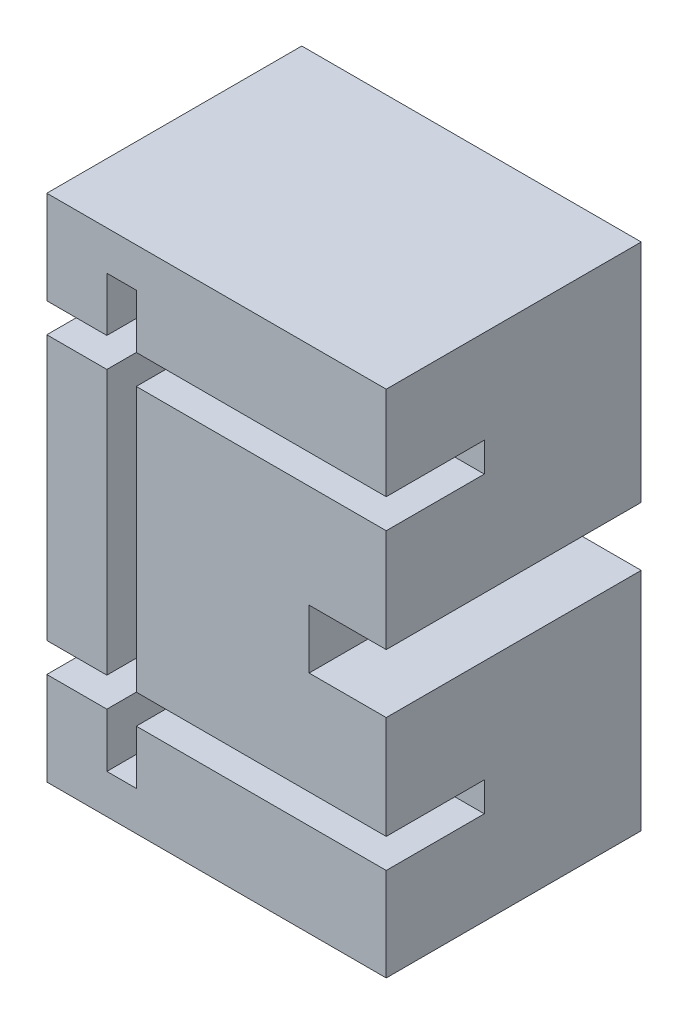
ISO-10303-21;
HEADER;
FILE_DESCRIPTION(('STEP AP214'),'2;1');
FILE_NAME('part.step','',(''),(''),'','','');
FILE_SCHEMA(('AUTOMOTIVE_DESIGN { 1 0 10303 214 1 1 1 1 }'));
ENDSEC;
DATA;
#1=APPLICATION_CONTEXT('core data for automotive mechanical design processes');
#2=APPLICATION_PROTOCOL_DEFINITION('international standard','automotive_design',2000,#1);
#3=PRODUCT_CONTEXT('',#1,'mechanical');
#4=PRODUCT('Part','Part','',(#3));
#5=PRODUCT_RELATED_PRODUCT_CATEGORY('part','',(#4));
#6=PRODUCT_DEFINITION_FORMATION('','',#4);
#7=PRODUCT_DEFINITION_CONTEXT('part definition',#1,'design');
#8=PRODUCT_DEFINITION('design','',#6,#7);
#9=PRODUCT_DEFINITION_SHAPE('','',#8);
#10=(LENGTH_UNIT() NAMED_UNIT(*) SI_UNIT(.MILLI.,.METRE.));
#11=(NAMED_UNIT(*) PLANE_ANGLE_UNIT() SI_UNIT($,.RADIAN.));
#12=(NAMED_UNIT(*) SI_UNIT($,.STERADIAN.) SOLID_ANGLE_UNIT());
#13=UNCERTAINTY_MEASURE_WITH_UNIT(LENGTH_MEASURE(1.E-05),#10,'distance_accuracy_value','');
#14=(GEOMETRIC_REPRESENTATION_CONTEXT(3) GLOBAL_UNCERTAINTY_ASSIGNED_CONTEXT((#13)) GLOBAL_UNIT_ASSIGNED_CONTEXT((#10,
#11,#12)) REPRESENTATION_CONTEXT('',''));
#15=CARTESIAN_POINT('',(0.,0.,0.));
#16=DIRECTION('',(0.,0.,1.));
#17=DIRECTION('',(1.,0.,0.));
#18=AXIS2_PLACEMENT_3D('',#15,#16,#17);
#19=CARTESIAN_POINT('',(10.2437538843778,0.,13.));
#20=DIRECTION('',(-1.,0.,0.));
#21=DIRECTION('',(0.,0.,1.));
#22=AXIS2_PLACEMENT_3D('',#19,#20,#21);
#23=PLANE('',#22);
#24=DIRECTION('',(0.,0.,1.));
#25=VECTOR('',#24,1.);
#26=CARTESIAN_POINT('',(10.2437538843778,8.25,8.));
#27=LINE('',#26,#25);
#28=CARTESIAN_POINT('',(10.2437538843778,8.25,8.));
#29=VERTEX_POINT('',#28);
#30=CARTESIAN_POINT('',(10.2437538843778,8.25,13.));
#31=VERTEX_POINT('',#30);
#32=EDGE_CURVE('E150',#29,#31,#27,.T.);
#33=ORIENTED_EDGE('',*,*,#32,.F.);
#34=DIRECTION('',(0.,1.,0.));
#35=VECTOR('',#34,1.);
#36=CARTESIAN_POINT('',(10.2437538843778,0.,8.));
#37=LINE('',#36,#35);
#38=CARTESIAN_POINT('',(10.2437538843778,6.75,8.));
#39=VERTEX_POINT('',#38);
#40=EDGE_CURVE('E284',#39,#29,#37,.T.);
#41=ORIENTED_EDGE('',*,*,#40,.F.);
#42=DIRECTION('',(0.,0.,1.));
#43=VECTOR('',#42,1.);
#44=CARTESIAN_POINT('',(10.2437538843778,6.75,8.));
#45=LINE('',#44,#43);
#46=CARTESIAN_POINT('',(10.2437538843778,6.75,13.));
#47=VERTEX_POINT('',#46);
#48=EDGE_CURVE('E295',#39,#47,#45,.T.);
#49=ORIENTED_EDGE('',*,*,#48,.T.);
#50=DIRECTION('',(0.,1.,0.));
#51=VECTOR('',#50,1.);
#52=CARTESIAN_POINT('',(10.2437538843778,0.,13.));
#53=LINE('',#52,#51);
#54=CARTESIAN_POINT('',(10.2437538843778,1.5,13.));
#55=VERTEX_POINT('',#54);
#56=EDGE_CURVE('E211',#55,#47,#53,.T.);
#57=ORIENTED_EDGE('',*,*,#56,.F.);
#58=DIRECTION('',(0.,0.,-1.));
#59=VECTOR('',#58,1.);
#60=CARTESIAN_POINT('',(10.2437538843778,1.5,13.));
#61=LINE('',#60,#59);
#62=CARTESIAN_POINT('',(10.2437538843778,1.5,0.));
#63=VERTEX_POINT('',#62);
#64=EDGE_CURVE('E57',#55,#63,#61,.T.);
#65=ORIENTED_EDGE('',*,*,#64,.T.);
#66=DIRECTION('',(0.,1.,0.));
#67=VECTOR('',#66,1.);
#68=CARTESIAN_POINT('',(10.2437538843778,0.,0.));
#69=LINE('',#68,#67);
#70=CARTESIAN_POINT('',(10.2437538843778,13.,0.));
#71=VERTEX_POINT('',#70);
#72=EDGE_CURVE('E147',#63,#71,#69,.T.);
#73=ORIENTED_EDGE('',*,*,#72,.T.);
#74=DIRECTION('',(0.,0.,-1.));
#75=VECTOR('',#74,1.);
#76=CARTESIAN_POINT('',(10.2437538843778,13.,13.));
#77=LINE('',#76,#75);
#78=CARTESIAN_POINT('',(10.2437538843778,13.,13.));
#79=VERTEX_POINT('',#78);
#80=EDGE_CURVE('E11',#79,#71,#77,.T.);
#81=ORIENTED_EDGE('',*,*,#80,.F.);
#82=EDGE_CURVE('E96',#31,#79,#53,.T.);
#83=ORIENTED_EDGE('',*,*,#82,.F.);
#84=EDGE_LOOP('',(#33,#41,#49,#57,#65,#73,#81,#83));
#85=FACE_BOUND('',#84,.T.);
#86=ADVANCED_FACE('F34',(#85),#23,.F.);
#87=CARTESIAN_POINT('',(10.2437538843778,0.,13.));
#88=DIRECTION('',(-1.,0.,0.));
#89=DIRECTION('',(0.,0.,1.));
#90=AXIS2_PLACEMENT_3D('',#87,#88,#89);
#91=PLANE('',#90);
#92=DIRECTION('',(0.,0.,1.));
#93=VECTOR('',#92,1.);
#94=CARTESIAN_POINT('',(10.2437538843778,-6.75,8.));
#95=LINE('',#94,#93);
#96=CARTESIAN_POINT('',(10.2437538843778,-6.75,8.));
#97=VERTEX_POINT('',#96);
#98=CARTESIAN_POINT('',(10.2437538843778,-6.75,13.));
#99=VERTEX_POINT('',#98);
#100=EDGE_CURVE('E239',#97,#99,#95,.T.);
#101=ORIENTED_EDGE('',*,*,#100,.F.);
#102=DIRECTION('',(0.,1.,0.));
#103=VECTOR('',#102,1.);
#104=CARTESIAN_POINT('',(10.2437538843778,0.,8.));
#105=LINE('',#104,#103);
#106=CARTESIAN_POINT('',(10.2437538843778,-8.25,8.));
#107=VERTEX_POINT('',#106);
#108=EDGE_CURVE('E235',#107,#97,#105,.T.);
#109=ORIENTED_EDGE('',*,*,#108,.F.);
#110=DIRECTION('',(0.,0.,1.));
#111=VECTOR('',#110,1.);
#112=CARTESIAN_POINT('',(10.2437538843778,-8.25,8.));
#113=LINE('',#112,#111);
#114=CARTESIAN_POINT('',(10.2437538843778,-8.25,13.));
#115=VERTEX_POINT('',#114);
#116=EDGE_CURVE('E232',#107,#115,#113,.T.);
#117=ORIENTED_EDGE('',*,*,#116,.T.);
#118=DIRECTION('',(0.,1.,0.));
#119=VECTOR('',#118,1.);
#120=CARTESIAN_POINT('',(10.2437538843778,0.,13.));
#121=LINE('',#120,#119);
#122=CARTESIAN_POINT('',(10.2437538843778,-13.,13.));
#123=VERTEX_POINT('',#122);
#124=EDGE_CURVE('E128',#123,#115,#121,.T.);
#125=ORIENTED_EDGE('',*,*,#124,.F.);
#126=DIRECTION('',(0.,0.,-1.));
#127=VECTOR('',#126,1.);
#128=CARTESIAN_POINT('',(10.2437538843778,-13.,13.));
#129=LINE('',#128,#127);
#130=CARTESIAN_POINT('',(10.2437538843778,-13.,0.));
#131=VERTEX_POINT('',#130);
#132=EDGE_CURVE('E169',#123,#131,#129,.T.);
#133=ORIENTED_EDGE('',*,*,#132,.T.);
#134=DIRECTION('',(0.,1.,0.));
#135=VECTOR('',#134,1.);
#136=CARTESIAN_POINT('',(10.2437538843778,0.,0.));
#137=LINE('',#136,#135);
#138=CARTESIAN_POINT('',(10.2437538843778,-1.5,0.));
#139=VERTEX_POINT('',#138);
#140=EDGE_CURVE('E158',#131,#139,#137,.T.);
#141=ORIENTED_EDGE('',*,*,#140,.T.);
#142=DIRECTION('',(0.,0.,-1.));
#143=VECTOR('',#142,1.);
#144=CARTESIAN_POINT('',(10.2437538843778,-1.5,13.));
#145=LINE('',#144,#143);
#146=CARTESIAN_POINT('',(10.2437538843778,-1.5,13.));
#147=VERTEX_POINT('',#146);
#148=EDGE_CURVE('E138',#147,#139,#145,.T.);
#149=ORIENTED_EDGE('',*,*,#148,.F.);
#150=EDGE_CURVE('E124',#99,#147,#121,.T.);
#151=ORIENTED_EDGE('',*,*,#150,.F.);
#152=EDGE_LOOP('',(#101,#109,#117,#125,#133,#141,#149,#151));
#153=FACE_BOUND('',#152,.T.);
#154=ADVANCED_FACE('F229',(#153),#91,.F.);
#155=CARTESIAN_POINT('',(0.,0.,13.));
#156=DIRECTION('',(0.,0.,1.));
#157=DIRECTION('',(1.,0.,0.));
#158=AXIS2_PLACEMENT_3D('',#155,#156,#157);
#159=PLANE('',#158);
#160=DIRECTION('',(1.,0.,0.));
#161=VECTOR('',#160,1.);
#162=CARTESIAN_POINT('',(0.,6.75,13.));
#163=LINE('',#162,#161);
#164=CARTESIAN_POINT('',(-2.5,6.75,13.));
#165=VERTEX_POINT('',#164);
#166=EDGE_CURVE('E290',#165,#47,#163,.T.);
#167=ORIENTED_EDGE('',*,*,#166,.F.);
#168=DIRECTION('',(0.,-1.,0.));
#169=VECTOR('',#168,1.);
#170=CARTESIAN_POINT('',(-2.5,0.,13.));
#171=LINE('',#170,#169);
#172=CARTESIAN_POINT('',(-2.5,-6.75,13.));
#173=VERTEX_POINT('',#172);
#174=EDGE_CURVE('E316',#165,#173,#171,.T.);
#175=ORIENTED_EDGE('',*,*,#174,.T.);
#176=DIRECTION('',(1.,0.,0.));
#177=VECTOR('',#176,1.);
#178=CARTESIAN_POINT('',(0.,-6.75,13.));
#179=LINE('',#178,#177);
#180=EDGE_CURVE('E324',#173,#99,#179,.T.);
#181=ORIENTED_EDGE('',*,*,#180,.T.);
#182=ORIENTED_EDGE('',*,*,#150,.T.);
#183=DIRECTION('',(-1.,0.,0.));
#184=VECTOR('',#183,1.);
#185=CARTESIAN_POINT('',(0.,-1.5,13.));
#186=LINE('',#185,#184);
#187=CARTESIAN_POINT('',(6.3125,-1.5,13.));
#188=VERTEX_POINT('',#187);
#189=EDGE_CURVE('E115',#147,#188,#186,.T.);
#190=ORIENTED_EDGE('',*,*,#189,.T.);
#191=DIRECTION('',(0.,-1.,0.));
#192=VECTOR('',#191,1.);
#193=CARTESIAN_POINT('',(6.3125,0.,13.));
#194=LINE('',#193,#192);
#195=CARTESIAN_POINT('',(6.3125,1.5,13.));
#196=VERTEX_POINT('',#195);
#197=EDGE_CURVE('E121',#196,#188,#194,.T.);
#198=ORIENTED_EDGE('',*,*,#197,.F.);
#199=DIRECTION('',(-1.,0.,0.));
#200=VECTOR('',#199,1.);
#201=CARTESIAN_POINT('',(0.,1.5,13.));
#202=LINE('',#201,#200);
#203=EDGE_CURVE('E142',#55,#196,#202,.T.);
#204=ORIENTED_EDGE('',*,*,#203,.F.);
#205=ORIENTED_EDGE('',*,*,#56,.T.);
#206=EDGE_LOOP('',(#167,#175,#181,#182,#190,#198,#204,#205));
#207=FACE_BOUND('',#206,.T.);
#208=ADVANCED_FACE('F118',(#207),#159,.T.);
#209=DIRECTION('',(0.,-1.,0.));
#210=VECTOR('',#209,1.);
#211=CARTESIAN_POINT('',(-7.06249999999999,0.,13.));
#212=LINE('',#211,#210);
#213=CARTESIAN_POINT('',(-7.06249999999999,6.75,13.));
#214=VERTEX_POINT('',#213);
#215=CARTESIAN_POINT('',(-7.06249999999999,-6.75,13.));
#216=VERTEX_POINT('',#215);
#217=EDGE_CURVE('E207',#214,#216,#212,.T.);
#218=ORIENTED_EDGE('',*,*,#217,.T.);
#219=DIRECTION('',(1.,0.,0.));
#220=VECTOR('',#219,1.);
#221=CARTESIAN_POINT('',(0.,-6.75,13.));
#222=LINE('',#221,#220);
#223=CARTESIAN_POINT('',(-4.,-6.75,13.));
#224=VERTEX_POINT('',#223);
#225=EDGE_CURVE('E342',#216,#224,#222,.T.);
#226=ORIENTED_EDGE('',*,*,#225,.T.);
#227=DIRECTION('',(0.,-1.,0.));
#228=VECTOR('',#227,1.);
#229=CARTESIAN_POINT('',(-4.,0.,13.));
#230=LINE('',#229,#228);
#231=CARTESIAN_POINT('',(-4.,6.75,13.));
#232=VERTEX_POINT('',#231);
#233=EDGE_CURVE('E345',#232,#224,#230,.T.);
#234=ORIENTED_EDGE('',*,*,#233,.F.);
#235=DIRECTION('',(1.,0.,0.));
#236=VECTOR('',#235,1.);
#237=CARTESIAN_POINT('',(0.,6.75,13.));
#238=LINE('',#237,#236);
#239=EDGE_CURVE('E348',#214,#232,#238,.T.);
#240=ORIENTED_EDGE('',*,*,#239,.F.);
#241=EDGE_LOOP('',(#218,#226,#234,#240));
#242=FACE_BOUND('',#241,.T.);
#243=ADVANCED_FACE('F508',(#242),#159,.T.);
#244=DIRECTION('',(0.,-1.,0.));
#245=VECTOR('',#244,1.);
#246=CARTESIAN_POINT('',(-2.5,0.,13.));
#247=LINE('',#246,#245);
#248=CARTESIAN_POINT('',(-2.5,11.,13.));
#249=VERTEX_POINT('',#248);
#250=CARTESIAN_POINT('',(-2.5,8.25,13.));
#251=VERTEX_POINT('',#250);
#252=EDGE_CURVE('E359',#249,#251,#247,.T.);
#253=ORIENTED_EDGE('',*,*,#252,.T.);
#254=DIRECTION('',(1.,0.,0.));
#255=VECTOR('',#254,1.);
#256=CARTESIAN_POINT('',(0.,8.25,13.));
#257=LINE('',#256,#255);
#258=EDGE_CURVE('E48',#251,#31,#257,.T.);
#259=ORIENTED_EDGE('',*,*,#258,.T.);
#260=ORIENTED_EDGE('',*,*,#82,.T.);
#261=DIRECTION('',(-1.,0.,0.));
#262=VECTOR('',#261,1.);
#263=CARTESIAN_POINT('',(0.,13.,13.));
#264=LINE('',#263,#262);
#265=CARTESIAN_POINT('',(-7.0625,13.,13.));
#266=VERTEX_POINT('',#265);
#267=EDGE_CURVE('E208',#79,#266,#264,.T.);
#268=ORIENTED_EDGE('',*,*,#267,.T.);
#269=CARTESIAN_POINT('',(-7.06249999999999,8.25,13.));
#270=VERTEX_POINT('',#269);
#271=EDGE_CURVE('E182',#266,#270,#212,.T.);
#272=ORIENTED_EDGE('',*,*,#271,.T.);
#273=DIRECTION('',(1.,0.,0.));
#274=VECTOR('',#273,1.);
#275=CARTESIAN_POINT('',(0.,8.25,13.));
#276=LINE('',#275,#274);
#277=CARTESIAN_POINT('',(-4.,8.25,13.));
#278=VERTEX_POINT('',#277);
#279=EDGE_CURVE('E351',#270,#278,#276,.T.);
#280=ORIENTED_EDGE('',*,*,#279,.T.);
#281=DIRECTION('',(0.,-1.,0.));
#282=VECTOR('',#281,1.);
#283=CARTESIAN_POINT('',(-4.,0.,13.));
#284=LINE('',#283,#282);
#285=CARTESIAN_POINT('',(-4.,11.,13.));
#286=VERTEX_POINT('',#285);
#287=EDGE_CURVE('E353',#286,#278,#284,.T.);
#288=ORIENTED_EDGE('',*,*,#287,.F.);
#289=DIRECTION('',(-1.,0.,0.));
#290=VECTOR('',#289,1.);
#291=CARTESIAN_POINT('',(0.,11.,13.));
#292=LINE('',#291,#290);
#293=EDGE_CURVE('E356',#249,#286,#292,.T.);
#294=ORIENTED_EDGE('',*,*,#293,.F.);
#295=EDGE_LOOP('',(#253,#259,#260,#268,#272,#280,#288,#294));
#296=FACE_BOUND('',#295,.T.);
#297=ADVANCED_FACE('F497',(#296),#159,.T.);
#298=CARTESIAN_POINT('',(0.,13.,13.));
#299=DIRECTION('',(0.,-1.,0.));
#300=DIRECTION('',(0.,0.,-1.));
#301=AXIS2_PLACEMENT_3D('',#298,#299,#300);
#302=PLANE('',#301);
#303=DIRECTION('',(-1.,0.,0.));
#304=VECTOR('',#303,1.);
#305=CARTESIAN_POINT('',(0.,13.,0.));
#306=LINE('',#305,#304);
#307=CARTESIAN_POINT('',(-7.0625,13.,0.));
#308=VERTEX_POINT('',#307);
#309=EDGE_CURVE('E149',#71,#308,#306,.T.);
#310=ORIENTED_EDGE('',*,*,#309,.T.);
#311=DIRECTION('',(0.,0.,-1.));
#312=VECTOR('',#311,1.);
#313=CARTESIAN_POINT('',(-7.0625,13.,13.));
#314=LINE('',#313,#312);
#315=EDGE_CURVE('E41',#266,#308,#314,.T.);
#316=ORIENTED_EDGE('',*,*,#315,.F.);
#317=ORIENTED_EDGE('',*,*,#267,.F.);
#318=ORIENTED_EDGE('',*,*,#80,.T.);
#319=EDGE_LOOP('',(#310,#316,#317,#318));
#320=FACE_BOUND('',#319,.T.);
#321=ADVANCED_FACE('F514',(#320),#302,.F.);
#322=CARTESIAN_POINT('',(-7.06249999999999,0.,13.));
#323=DIRECTION('',(1.,0.,0.));
#324=DIRECTION('',(0.,1.,0.));
#325=AXIS2_PLACEMENT_3D('',#322,#323,#324);
#326=PLANE('',#325);
#327=ORIENTED_EDGE('',*,*,#217,.F.);
#328=DIRECTION('',(0.,0.,1.));
#329=VECTOR('',#328,1.);
#330=CARTESIAN_POINT('',(-7.06249999999999,6.75,8.));
#331=LINE('',#330,#329);
#332=CARTESIAN_POINT('',(-7.06249999999999,6.75,8.));
#333=VERTEX_POINT('',#332);
#334=EDGE_CURVE('E268',#333,#214,#331,.T.);
#335=ORIENTED_EDGE('',*,*,#334,.F.);
#336=DIRECTION('',(0.,-1.,0.));
#337=VECTOR('',#336,1.);
#338=CARTESIAN_POINT('',(-7.06249999999999,0.,8.));
#339=LINE('',#338,#337);
#340=CARTESIAN_POINT('',(-7.06249999999999,8.25,8.));
#341=VERTEX_POINT('',#340);
#342=EDGE_CURVE('E396',#341,#333,#339,.T.);
#343=ORIENTED_EDGE('',*,*,#342,.F.);
#344=DIRECTION('',(0.,0.,1.));
#345=VECTOR('',#344,1.);
#346=CARTESIAN_POINT('',(-7.06249999999999,8.25,8.));
#347=LINE('',#346,#345);
#348=EDGE_CURVE('E271',#341,#270,#347,.T.);
#349=ORIENTED_EDGE('',*,*,#348,.T.);
#350=ORIENTED_EDGE('',*,*,#271,.F.);
#351=ORIENTED_EDGE('',*,*,#315,.T.);
#352=DIRECTION('',(0.,-1.,0.));
#353=VECTOR('',#352,1.);
#354=CARTESIAN_POINT('',(-7.06249999999999,0.,0.));
#355=LINE('',#354,#353);
#356=CARTESIAN_POINT('',(-7.06249999999999,-13.,0.));
#357=VERTEX_POINT('',#356);
#358=EDGE_CURVE('E152',#308,#357,#355,.T.);
#359=ORIENTED_EDGE('',*,*,#358,.T.);
#360=DIRECTION('',(0.,0.,-1.));
#361=VECTOR('',#360,1.);
#362=CARTESIAN_POINT('',(-7.06249999999999,-13.,13.));
#363=LINE('',#362,#361);
#364=CARTESIAN_POINT('',(-7.06249999999999,-13.,13.));
#365=VERTEX_POINT('',#364);
#366=EDGE_CURVE('E171',#365,#357,#363,.T.);
#367=ORIENTED_EDGE('',*,*,#366,.F.);
#368=CARTESIAN_POINT('',(-7.06249999999999,-8.25,13.));
#369=VERTEX_POINT('',#368);
#370=EDGE_CURVE('E197',#369,#365,#212,.T.);
#371=ORIENTED_EDGE('',*,*,#370,.F.);
#372=DIRECTION('',(0.,0.,1.));
#373=VECTOR('',#372,1.);
#374=CARTESIAN_POINT('',(-7.06249999999999,-8.25,8.));
#375=LINE('',#374,#373);
#376=CARTESIAN_POINT('',(-7.06249999999999,-8.25,8.));
#377=VERTEX_POINT('',#376);
#378=EDGE_CURVE('E201',#377,#369,#375,.T.);
#379=ORIENTED_EDGE('',*,*,#378,.F.);
#380=DIRECTION('',(0.,-1.,0.));
#381=VECTOR('',#380,1.);
#382=CARTESIAN_POINT('',(-7.06249999999999,0.,8.));
#383=LINE('',#382,#381);
#384=CARTESIAN_POINT('',(-7.06249999999999,-6.75,8.));
#385=VERTEX_POINT('',#384);
#386=EDGE_CURVE('E384',#385,#377,#383,.T.);
#387=ORIENTED_EDGE('',*,*,#386,.F.);
#388=DIRECTION('',(0.,0.,1.));
#389=VECTOR('',#388,1.);
#390=CARTESIAN_POINT('',(-7.06249999999999,-6.75,8.));
#391=LINE('',#390,#389);
#392=EDGE_CURVE('E259',#385,#216,#391,.T.);
#393=ORIENTED_EDGE('',*,*,#392,.T.);
#394=EDGE_LOOP('',(#327,#335,#343,#349,#350,#351,#359,#367,#371,#379,#387,#393));
#395=FACE_BOUND('',#394,.T.);
#396=ADVANCED_FACE('F178',(#395),#326,.F.);
#397=CARTESIAN_POINT('',(0.,-13.,13.));
#398=DIRECTION('',(0.,-1.,0.));
#399=DIRECTION('',(0.,0.,-1.));
#400=AXIS2_PLACEMENT_3D('',#397,#398,#399);
#401=PLANE('',#400);
#402=DIRECTION('',(-1.,0.,0.));
#403=VECTOR('',#402,1.);
#404=CARTESIAN_POINT('',(0.,-13.,0.));
#405=LINE('',#404,#403);
#406=EDGE_CURVE('E155',#131,#357,#405,.T.);
#407=ORIENTED_EDGE('',*,*,#406,.F.);
#408=ORIENTED_EDGE('',*,*,#132,.F.);
#409=DIRECTION('',(-1.,0.,0.));
#410=VECTOR('',#409,1.);
#411=CARTESIAN_POINT('',(0.,-13.,13.));
#412=LINE('',#411,#410);
#413=EDGE_CURVE('E193',#123,#365,#412,.T.);
#414=ORIENTED_EDGE('',*,*,#413,.T.);
#415=ORIENTED_EDGE('',*,*,#366,.T.);
#416=EDGE_LOOP('',(#407,#408,#414,#415));
#417=FACE_BOUND('',#416,.T.);
#418=ADVANCED_FACE('F189',(#417),#401,.T.);
#419=CARTESIAN_POINT('',(0.,-1.5,13.));
#420=DIRECTION('',(0.,-1.,0.));
#421=DIRECTION('',(0.,0.,-1.));
#422=AXIS2_PLACEMENT_3D('',#419,#420,#421);
#423=PLANE('',#422);
#424=DIRECTION('',(-1.,0.,0.));
#425=VECTOR('',#424,1.);
#426=CARTESIAN_POINT('',(0.,-1.5,0.));
#427=LINE('',#426,#425);
#428=CARTESIAN_POINT('',(6.3125,-1.5,0.));
#429=VERTEX_POINT('',#428);
#430=EDGE_CURVE('E134',#139,#429,#427,.T.);
#431=ORIENTED_EDGE('',*,*,#430,.T.);
#432=DIRECTION('',(0.,0.,-1.));
#433=VECTOR('',#432,1.);
#434=CARTESIAN_POINT('',(6.3125,-1.5,13.));
#435=LINE('',#434,#433);
#436=EDGE_CURVE('E131',#188,#429,#435,.T.);
#437=ORIENTED_EDGE('',*,*,#436,.F.);
#438=ORIENTED_EDGE('',*,*,#189,.F.);
#439=ORIENTED_EDGE('',*,*,#148,.T.);
#440=EDGE_LOOP('',(#431,#437,#438,#439));
#441=FACE_BOUND('',#440,.T.);
#442=ADVANCED_FACE('F132',(#441),#423,.F.);
#443=CARTESIAN_POINT('',(6.3125,0.,13.));
#444=DIRECTION('',(1.,0.,0.));
#445=DIRECTION('',(0.,0.,-1.));
#446=AXIS2_PLACEMENT_3D('',#443,#444,#445);
#447=PLANE('',#446);
#448=DIRECTION('',(0.,-1.,0.));
#449=VECTOR('',#448,1.);
#450=CARTESIAN_POINT('',(6.3125,0.,0.));
#451=LINE('',#450,#449);
#452=CARTESIAN_POINT('',(6.3125,1.5,0.));
#453=VERTEX_POINT('',#452);
#454=EDGE_CURVE('E161',#453,#429,#451,.T.);
#455=ORIENTED_EDGE('',*,*,#454,.F.);
#456=DIRECTION('',(0.,0.,-1.));
#457=VECTOR('',#456,1.);
#458=CARTESIAN_POINT('',(6.3125,1.5,13.));
#459=LINE('',#458,#457);
#460=EDGE_CURVE('E139',#196,#453,#459,.T.);
#461=ORIENTED_EDGE('',*,*,#460,.F.);
#462=ORIENTED_EDGE('',*,*,#197,.T.);
#463=ORIENTED_EDGE('',*,*,#436,.T.);
#464=EDGE_LOOP('',(#455,#461,#462,#463));
#465=FACE_BOUND('',#464,.T.);
#466=ADVANCED_FACE('F141',(#465),#447,.T.);
#467=CARTESIAN_POINT('',(0.,1.5,13.));
#468=DIRECTION('',(0.,-1.,0.));
#469=DIRECTION('',(0.,0.,-1.));
#470=AXIS2_PLACEMENT_3D('',#467,#468,#469);
#471=PLANE('',#470);
#472=DIRECTION('',(-1.,0.,0.));
#473=VECTOR('',#472,1.);
#474=CARTESIAN_POINT('',(0.,1.5,0.));
#475=LINE('',#474,#473);
#476=EDGE_CURVE('E163',#63,#453,#475,.T.);
#477=ORIENTED_EDGE('',*,*,#476,.F.);
#478=ORIENTED_EDGE('',*,*,#64,.F.);
#479=ORIENTED_EDGE('',*,*,#203,.T.);
#480=ORIENTED_EDGE('',*,*,#460,.T.);
#481=EDGE_LOOP('',(#477,#478,#479,#480));
#482=FACE_BOUND('',#481,.T.);
#483=ADVANCED_FACE('F489',(#482),#471,.T.);
#484=DIRECTION('',(1.,0.,0.));
#485=VECTOR('',#484,1.);
#486=CARTESIAN_POINT('',(0.,-8.25,13.));
#487=LINE('',#486,#485);
#488=CARTESIAN_POINT('',(-2.5,-8.25,13.));
#489=VERTEX_POINT('',#488);
#490=EDGE_CURVE('E223',#489,#115,#487,.T.);
#491=ORIENTED_EDGE('',*,*,#490,.F.);
#492=DIRECTION('',(0.,-1.,0.));
#493=VECTOR('',#492,1.);
#494=CARTESIAN_POINT('',(-2.5,0.,13.));
#495=LINE('',#494,#493);
#496=CARTESIAN_POINT('',(-2.5,-11.,13.));
#497=VERTEX_POINT('',#496);
#498=EDGE_CURVE('E331',#489,#497,#495,.T.);
#499=ORIENTED_EDGE('',*,*,#498,.T.);
#500=DIRECTION('',(-1.,0.,0.));
#501=VECTOR('',#500,1.);
#502=CARTESIAN_POINT('',(0.,-11.,13.));
#503=LINE('',#502,#501);
#504=CARTESIAN_POINT('',(-4.,-11.,13.));
#505=VERTEX_POINT('',#504);
#506=EDGE_CURVE('E333',#497,#505,#503,.T.);
#507=ORIENTED_EDGE('',*,*,#506,.T.);
#508=DIRECTION('',(0.,-1.,0.));
#509=VECTOR('',#508,1.);
#510=CARTESIAN_POINT('',(-4.,0.,13.));
#511=LINE('',#510,#509);
#512=CARTESIAN_POINT('',(-4.,-8.25,13.));
#513=VERTEX_POINT('',#512);
#514=EDGE_CURVE('E336',#513,#505,#511,.T.);
#515=ORIENTED_EDGE('',*,*,#514,.F.);
#516=DIRECTION('',(1.,0.,0.));
#517=VECTOR('',#516,1.);
#518=CARTESIAN_POINT('',(0.,-8.25,13.));
#519=LINE('',#518,#517);
#520=EDGE_CURVE('E339',#369,#513,#519,.T.);
#521=ORIENTED_EDGE('',*,*,#520,.F.);
#522=ORIENTED_EDGE('',*,*,#370,.T.);
#523=ORIENTED_EDGE('',*,*,#413,.F.);
#524=ORIENTED_EDGE('',*,*,#124,.T.);
#525=EDGE_LOOP('',(#491,#499,#507,#515,#521,#522,#523,#524));
#526=FACE_BOUND('',#525,.T.);
#527=ADVANCED_FACE('F219',(#526),#159,.T.);
#528=CARTESIAN_POINT('',(0.,0.,0.));
#529=DIRECTION('',(0.,0.,1.));
#530=DIRECTION('',(1.,0.,0.));
#531=AXIS2_PLACEMENT_3D('',#528,#529,#530);
#532=PLANE('',#531);
#533=ORIENTED_EDGE('',*,*,#72,.F.);
#534=ORIENTED_EDGE('',*,*,#476,.T.);
#535=ORIENTED_EDGE('',*,*,#454,.T.);
#536=ORIENTED_EDGE('',*,*,#430,.F.);
#537=ORIENTED_EDGE('',*,*,#140,.F.);
#538=ORIENTED_EDGE('',*,*,#406,.T.);
#539=ORIENTED_EDGE('',*,*,#358,.F.);
#540=ORIENTED_EDGE('',*,*,#309,.F.);
#541=EDGE_LOOP('',(#533,#534,#535,#536,#537,#538,#539,#540));
#542=FACE_BOUND('',#541,.T.);
#543=ADVANCED_FACE('F185',(#542),#532,.F.);
#544=CARTESIAN_POINT('',(0.,8.25,8.));
#545=DIRECTION('',(0.,-1.,0.));
#546=DIRECTION('',(0.,0.,-1.));
#547=AXIS2_PLACEMENT_3D('',#544,#545,#546);
#548=PLANE('',#547);
#549=ORIENTED_EDGE('',*,*,#258,.F.);
#550=DIRECTION('',(0.,0.,1.));
#551=VECTOR('',#550,1.);
#552=CARTESIAN_POINT('',(-2.5,8.25,8.));
#553=LINE('',#552,#551);
#554=CARTESIAN_POINT('',(-2.5,8.25,8.));
#555=VERTEX_POINT('',#554);
#556=EDGE_CURVE('E282',#555,#251,#553,.T.);
#557=ORIENTED_EDGE('',*,*,#556,.F.);
#558=DIRECTION('',(1.,0.,0.));
#559=VECTOR('',#558,1.);
#560=CARTESIAN_POINT('',(0.,8.25,8.));
#561=LINE('',#560,#559);
#562=EDGE_CURVE('E328',#555,#29,#561,.T.);
#563=ORIENTED_EDGE('',*,*,#562,.T.);
#564=ORIENTED_EDGE('',*,*,#32,.T.);
#565=EDGE_LOOP('',(#549,#557,#563,#564));
#566=FACE_BOUND('',#565,.T.);
#567=ADVANCED_FACE('F413',(#566),#548,.T.);
#568=CARTESIAN_POINT('',(0.,6.75,8.));
#569=DIRECTION('',(0.,-1.,0.));
#570=DIRECTION('',(0.,0.,-1.));
#571=AXIS2_PLACEMENT_3D('',#568,#569,#570);
#572=PLANE('',#571);
#573=ORIENTED_EDGE('',*,*,#166,.T.);
#574=ORIENTED_EDGE('',*,*,#48,.F.);
#575=DIRECTION('',(1.,0.,0.));
#576=VECTOR('',#575,1.);
#577=CARTESIAN_POINT('',(0.,6.75,8.));
#578=LINE('',#577,#576);
#579=CARTESIAN_POINT('',(-2.5,6.75,8.));
#580=VERTEX_POINT('',#579);
#581=EDGE_CURVE('E364',#580,#39,#578,.T.);
#582=ORIENTED_EDGE('',*,*,#581,.F.);
#583=DIRECTION('',(0.,0.,1.));
#584=VECTOR('',#583,1.);
#585=CARTESIAN_POINT('',(-2.5,6.75,8.));
#586=LINE('',#585,#584);
#587=EDGE_CURVE('E301',#580,#165,#586,.T.);
#588=ORIENTED_EDGE('',*,*,#587,.T.);
#589=EDGE_LOOP('',(#573,#574,#582,#588));
#590=FACE_BOUND('',#589,.T.);
#591=ADVANCED_FACE('F487',(#590),#572,.F.);
#592=CARTESIAN_POINT('',(-2.5,0.,8.));
#593=DIRECTION('',(-1.,0.,0.));
#594=DIRECTION('',(0.,-1.,0.));
#595=AXIS2_PLACEMENT_3D('',#592,#593,#594);
#596=PLANE('',#595);
#597=ORIENTED_EDGE('',*,*,#174,.F.);
#598=ORIENTED_EDGE('',*,*,#587,.F.);
#599=DIRECTION('',(0.,-1.,0.));
#600=VECTOR('',#599,1.);
#601=CARTESIAN_POINT('',(-2.5,0.,8.));
#602=LINE('',#601,#600);
#603=CARTESIAN_POINT('',(-2.5,-6.75,8.));
#604=VERTEX_POINT('',#603);
#605=EDGE_CURVE('E319',#580,#604,#602,.T.);
#606=ORIENTED_EDGE('',*,*,#605,.T.);
#607=DIRECTION('',(0.,0.,1.));
#608=VECTOR('',#607,1.);
#609=CARTESIAN_POINT('',(-2.5,-6.75,8.));
#610=LINE('',#609,#608);
#611=EDGE_CURVE('E243',#604,#173,#610,.T.);
#612=ORIENTED_EDGE('',*,*,#611,.T.);
#613=EDGE_LOOP('',(#597,#598,#606,#612));
#614=FACE_BOUND('',#613,.T.);
#615=ADVANCED_FACE('F314',(#614),#596,.T.);
#616=CARTESIAN_POINT('',(0.,-6.75,8.));
#617=DIRECTION('',(0.,-1.,0.));
#618=DIRECTION('',(0.,0.,-1.));
#619=AXIS2_PLACEMENT_3D('',#616,#617,#618);
#620=PLANE('',#619);
#621=ORIENTED_EDGE('',*,*,#180,.F.);
#622=ORIENTED_EDGE('',*,*,#611,.F.);
#623=DIRECTION('',(1.,0.,0.));
#624=VECTOR('',#623,1.);
#625=CARTESIAN_POINT('',(0.,-6.75,8.));
#626=LINE('',#625,#624);
#627=EDGE_CURVE('E367',#604,#97,#626,.T.);
#628=ORIENTED_EDGE('',*,*,#627,.T.);
#629=ORIENTED_EDGE('',*,*,#100,.T.);
#630=EDGE_LOOP('',(#621,#622,#628,#629));
#631=FACE_BOUND('',#630,.T.);
#632=ADVANCED_FACE('F325',(#631),#620,.T.);
#633=CARTESIAN_POINT('',(0.,-8.25,8.));
#634=DIRECTION('',(0.,-1.,0.));
#635=DIRECTION('',(0.,0.,-1.));
#636=AXIS2_PLACEMENT_3D('',#633,#634,#635);
#637=PLANE('',#636);
#638=ORIENTED_EDGE('',*,*,#490,.T.);
#639=ORIENTED_EDGE('',*,*,#116,.F.);
#640=DIRECTION('',(1.,0.,0.));
#641=VECTOR('',#640,1.);
#642=CARTESIAN_POINT('',(0.,-8.25,8.));
#643=LINE('',#642,#641);
#644=CARTESIAN_POINT('',(-2.5,-8.25,8.));
#645=VERTEX_POINT('',#644);
#646=EDGE_CURVE('E370',#645,#107,#643,.T.);
#647=ORIENTED_EDGE('',*,*,#646,.F.);
#648=DIRECTION('',(0.,0.,1.));
#649=VECTOR('',#648,1.);
#650=CARTESIAN_POINT('',(-2.5,-8.25,8.));
#651=LINE('',#650,#649);
#652=EDGE_CURVE('E240',#645,#489,#651,.T.);
#653=ORIENTED_EDGE('',*,*,#652,.T.);
#654=EDGE_LOOP('',(#638,#639,#647,#653));
#655=FACE_BOUND('',#654,.T.);
#656=ADVANCED_FACE('F598',(#655),#637,.F.);
#657=CARTESIAN_POINT('',(-2.5,0.,8.));
#658=DIRECTION('',(-1.,0.,0.));
#659=DIRECTION('',(0.,-1.,0.));
#660=AXIS2_PLACEMENT_3D('',#657,#658,#659);
#661=PLANE('',#660);
#662=ORIENTED_EDGE('',*,*,#498,.F.);
#663=ORIENTED_EDGE('',*,*,#652,.F.);
#664=DIRECTION('',(0.,-1.,0.));
#665=VECTOR('',#664,1.);
#666=CARTESIAN_POINT('',(-2.5,0.,8.));
#667=LINE('',#666,#665);
#668=CARTESIAN_POINT('',(-2.5,-11.,8.));
#669=VERTEX_POINT('',#668);
#670=EDGE_CURVE('E372',#645,#669,#667,.T.);
#671=ORIENTED_EDGE('',*,*,#670,.T.);
#672=DIRECTION('',(0.,0.,1.));
#673=VECTOR('',#672,1.);
#674=CARTESIAN_POINT('',(-2.5,-11.,8.));
#675=LINE('',#674,#673);
#676=EDGE_CURVE('E246',#669,#497,#675,.T.);
#677=ORIENTED_EDGE('',*,*,#676,.T.);
#678=EDGE_LOOP('',(#662,#663,#671,#677));
#679=FACE_BOUND('',#678,.T.);
#680=ADVANCED_FACE('F605',(#679),#661,.T.);
#681=CARTESIAN_POINT('',(0.,-11.,8.));
#682=DIRECTION('',(0.,1.,0.));
#683=DIRECTION('',(0.,0.,1.));
#684=AXIS2_PLACEMENT_3D('',#681,#682,#683);
#685=PLANE('',#684);
#686=ORIENTED_EDGE('',*,*,#506,.F.);
#687=ORIENTED_EDGE('',*,*,#676,.F.);
#688=DIRECTION('',(-1.,0.,0.));
#689=VECTOR('',#688,1.);
#690=CARTESIAN_POINT('',(0.,-11.,8.));
#691=LINE('',#690,#689);
#692=CARTESIAN_POINT('',(-4.,-11.,8.));
#693=VERTEX_POINT('',#692);
#694=EDGE_CURVE('E375',#669,#693,#691,.T.);
#695=ORIENTED_EDGE('',*,*,#694,.T.);
#696=DIRECTION('',(0.,0.,1.));
#697=VECTOR('',#696,1.);
#698=CARTESIAN_POINT('',(-4.,-11.,8.));
#699=LINE('',#698,#697);
#700=EDGE_CURVE('E252',#693,#505,#699,.T.);
#701=ORIENTED_EDGE('',*,*,#700,.T.);
#702=EDGE_LOOP('',(#686,#687,#695,#701));
#703=FACE_BOUND('',#702,.T.);
#704=ADVANCED_FACE('F612',(#703),#685,.T.);
#705=CARTESIAN_POINT('',(-4.,0.,8.));
#706=DIRECTION('',(-1.,0.,0.));
#707=DIRECTION('',(0.,0.,1.));
#708=AXIS2_PLACEMENT_3D('',#705,#706,#707);
#709=PLANE('',#708);
#710=ORIENTED_EDGE('',*,*,#514,.T.);
#711=ORIENTED_EDGE('',*,*,#700,.F.);
#712=DIRECTION('',(0.,-1.,0.));
#713=VECTOR('',#712,1.);
#714=CARTESIAN_POINT('',(-4.,0.,8.));
#715=LINE('',#714,#713);
#716=CARTESIAN_POINT('',(-4.,-8.25,8.));
#717=VERTEX_POINT('',#716);
#718=EDGE_CURVE('E378',#717,#693,#715,.T.);
#719=ORIENTED_EDGE('',*,*,#718,.F.);
#720=DIRECTION('',(0.,0.,1.));
#721=VECTOR('',#720,1.);
#722=CARTESIAN_POINT('',(-4.,-8.25,8.));
#723=LINE('',#722,#721);
#724=EDGE_CURVE('E255',#717,#513,#723,.T.);
#725=ORIENTED_EDGE('',*,*,#724,.T.);
#726=EDGE_LOOP('',(#710,#711,#719,#725));
#727=FACE_BOUND('',#726,.T.);
#728=ADVANCED_FACE('F554',(#727),#709,.F.);
#729=CARTESIAN_POINT('',(0.,-8.25,8.));
#730=DIRECTION('',(0.,-1.,0.));
#731=DIRECTION('',(0.,0.,-1.));
#732=AXIS2_PLACEMENT_3D('',#729,#730,#731);
#733=PLANE('',#732);
#734=ORIENTED_EDGE('',*,*,#520,.T.);
#735=ORIENTED_EDGE('',*,*,#724,.F.);
#736=DIRECTION('',(1.,0.,0.));
#737=VECTOR('',#736,1.);
#738=CARTESIAN_POINT('',(0.,-8.25,8.));
#739=LINE('',#738,#737);
#740=EDGE_CURVE('E381',#377,#717,#739,.T.);
#741=ORIENTED_EDGE('',*,*,#740,.F.);
#742=ORIENTED_EDGE('',*,*,#378,.T.);
#743=EDGE_LOOP('',(#734,#735,#741,#742));
#744=FACE_BOUND('',#743,.T.);
#745=ADVANCED_FACE('F547',(#744),#733,.F.);
#746=CARTESIAN_POINT('',(0.,-6.75,8.));
#747=DIRECTION('',(0.,-1.,0.));
#748=DIRECTION('',(0.,0.,-1.));
#749=AXIS2_PLACEMENT_3D('',#746,#747,#748);
#750=PLANE('',#749);
#751=ORIENTED_EDGE('',*,*,#225,.F.);
#752=ORIENTED_EDGE('',*,*,#392,.F.);
#753=DIRECTION('',(1.,0.,0.));
#754=VECTOR('',#753,1.);
#755=CARTESIAN_POINT('',(0.,-6.75,8.));
#756=LINE('',#755,#754);
#757=CARTESIAN_POINT('',(-4.,-6.75,8.));
#758=VERTEX_POINT('',#757);
#759=EDGE_CURVE('E387',#385,#758,#756,.T.);
#760=ORIENTED_EDGE('',*,*,#759,.T.);
#761=DIRECTION('',(0.,0.,1.));
#762=VECTOR('',#761,1.);
#763=CARTESIAN_POINT('',(-4.,-6.75,8.));
#764=LINE('',#763,#762);
#765=EDGE_CURVE('E262',#758,#224,#764,.T.);
#766=ORIENTED_EDGE('',*,*,#765,.T.);
#767=EDGE_LOOP('',(#751,#752,#760,#766));
#768=FACE_BOUND('',#767,.T.);
#769=ADVANCED_FACE('F545',(#768),#750,.T.);
#770=CARTESIAN_POINT('',(-4.,0.,8.));
#771=DIRECTION('',(-1.,0.,0.));
#772=DIRECTION('',(0.,0.,1.));
#773=AXIS2_PLACEMENT_3D('',#770,#771,#772);
#774=PLANE('',#773);
#775=ORIENTED_EDGE('',*,*,#233,.T.);
#776=ORIENTED_EDGE('',*,*,#765,.F.);
#777=DIRECTION('',(0.,-1.,0.));
#778=VECTOR('',#777,1.);
#779=CARTESIAN_POINT('',(-4.,0.,8.));
#780=LINE('',#779,#778);
#781=CARTESIAN_POINT('',(-4.,6.75,8.));
#782=VERTEX_POINT('',#781);
#783=EDGE_CURVE('E390',#782,#758,#780,.T.);
#784=ORIENTED_EDGE('',*,*,#783,.F.);
#785=DIRECTION('',(0.,0.,1.));
#786=VECTOR('',#785,1.);
#787=CARTESIAN_POINT('',(-4.,6.75,8.));
#788=LINE('',#787,#786);
#789=EDGE_CURVE('E265',#782,#232,#788,.T.);
#790=ORIENTED_EDGE('',*,*,#789,.T.);
#791=EDGE_LOOP('',(#775,#776,#784,#790));
#792=FACE_BOUND('',#791,.T.);
#793=ADVANCED_FACE('F541',(#792),#774,.F.);
#794=CARTESIAN_POINT('',(0.,6.75,8.));
#795=DIRECTION('',(0.,-1.,0.));
#796=DIRECTION('',(0.,0.,-1.));
#797=AXIS2_PLACEMENT_3D('',#794,#795,#796);
#798=PLANE('',#797);
#799=ORIENTED_EDGE('',*,*,#239,.T.);
#800=ORIENTED_EDGE('',*,*,#789,.F.);
#801=DIRECTION('',(1.,0.,0.));
#802=VECTOR('',#801,1.);
#803=CARTESIAN_POINT('',(0.,6.75,8.));
#804=LINE('',#803,#802);
#805=EDGE_CURVE('E393',#333,#782,#804,.T.);
#806=ORIENTED_EDGE('',*,*,#805,.F.);
#807=ORIENTED_EDGE('',*,*,#334,.T.);
#808=EDGE_LOOP('',(#799,#800,#806,#807));
#809=FACE_BOUND('',#808,.T.);
#810=ADVANCED_FACE('F536',(#809),#798,.F.);
#811=CARTESIAN_POINT('',(0.,8.25,8.));
#812=DIRECTION('',(0.,-1.,0.));
#813=DIRECTION('',(0.,0.,-1.));
#814=AXIS2_PLACEMENT_3D('',#811,#812,#813);
#815=PLANE('',#814);
#816=ORIENTED_EDGE('',*,*,#279,.F.);
#817=ORIENTED_EDGE('',*,*,#348,.F.);
#818=DIRECTION('',(1.,0.,0.));
#819=VECTOR('',#818,1.);
#820=CARTESIAN_POINT('',(0.,8.25,8.));
#821=LINE('',#820,#819);
#822=CARTESIAN_POINT('',(-4.,8.25,8.));
#823=VERTEX_POINT('',#822);
#824=EDGE_CURVE('E399',#341,#823,#821,.T.);
#825=ORIENTED_EDGE('',*,*,#824,.T.);
#826=DIRECTION('',(0.,0.,1.));
#827=VECTOR('',#826,1.);
#828=CARTESIAN_POINT('',(-4.,8.25,8.));
#829=LINE('',#828,#827);
#830=EDGE_CURVE('E273',#823,#278,#829,.T.);
#831=ORIENTED_EDGE('',*,*,#830,.T.);
#832=EDGE_LOOP('',(#816,#817,#825,#831));
#833=FACE_BOUND('',#832,.T.);
#834=ADVANCED_FACE('F561',(#833),#815,.T.);
#835=CARTESIAN_POINT('',(-4.,0.,8.));
#836=DIRECTION('',(-1.,0.,0.));
#837=DIRECTION('',(0.,0.,1.));
#838=AXIS2_PLACEMENT_3D('',#835,#836,#837);
#839=PLANE('',#838);
#840=ORIENTED_EDGE('',*,*,#287,.T.);
#841=ORIENTED_EDGE('',*,*,#830,.F.);
#842=DIRECTION('',(0.,-1.,0.));
#843=VECTOR('',#842,1.);
#844=CARTESIAN_POINT('',(-4.,0.,8.));
#845=LINE('',#844,#843);
#846=CARTESIAN_POINT('',(-4.,11.,8.));
#847=VERTEX_POINT('',#846);
#848=EDGE_CURVE('E402',#847,#823,#845,.T.);
#849=ORIENTED_EDGE('',*,*,#848,.F.);
#850=DIRECTION('',(0.,0.,1.));
#851=VECTOR('',#850,1.);
#852=CARTESIAN_POINT('',(-4.,11.,8.));
#853=LINE('',#852,#851);
#854=EDGE_CURVE('E276',#847,#286,#853,.T.);
#855=ORIENTED_EDGE('',*,*,#854,.T.);
#856=EDGE_LOOP('',(#840,#841,#849,#855));
#857=FACE_BOUND('',#856,.T.);
#858=ADVANCED_FACE('F529',(#857),#839,.F.);
#859=CARTESIAN_POINT('',(0.,11.,8.));
#860=DIRECTION('',(0.,1.,0.));
#861=DIRECTION('',(0.,0.,1.));
#862=AXIS2_PLACEMENT_3D('',#859,#860,#861);
#863=PLANE('',#862);
#864=ORIENTED_EDGE('',*,*,#293,.T.);
#865=ORIENTED_EDGE('',*,*,#854,.F.);
#866=DIRECTION('',(-1.,0.,0.));
#867=VECTOR('',#866,1.);
#868=CARTESIAN_POINT('',(0.,11.,8.));
#869=LINE('',#868,#867);
#870=CARTESIAN_POINT('',(-2.5,11.,8.));
#871=VERTEX_POINT('',#870);
#872=EDGE_CURVE('E405',#871,#847,#869,.T.);
#873=ORIENTED_EDGE('',*,*,#872,.F.);
#874=DIRECTION('',(0.,0.,1.));
#875=VECTOR('',#874,1.);
#876=CARTESIAN_POINT('',(-2.5,11.,8.));
#877=LINE('',#876,#875);
#878=EDGE_CURVE('E279',#871,#249,#877,.T.);
#879=ORIENTED_EDGE('',*,*,#878,.T.);
#880=EDGE_LOOP('',(#864,#865,#873,#879));
#881=FACE_BOUND('',#880,.T.);
#882=ADVANCED_FACE('F525',(#881),#863,.F.);
#883=CARTESIAN_POINT('',(-2.5,0.,8.));
#884=DIRECTION('',(-1.,0.,0.));
#885=DIRECTION('',(0.,-1.,0.));
#886=AXIS2_PLACEMENT_3D('',#883,#884,#885);
#887=PLANE('',#886);
#888=ORIENTED_EDGE('',*,*,#252,.F.);
#889=ORIENTED_EDGE('',*,*,#878,.F.);
#890=DIRECTION('',(0.,-1.,0.));
#891=VECTOR('',#890,1.);
#892=CARTESIAN_POINT('',(-2.5,0.,8.));
#893=LINE('',#892,#891);
#894=EDGE_CURVE('E408',#871,#555,#893,.T.);
#895=ORIENTED_EDGE('',*,*,#894,.T.);
#896=ORIENTED_EDGE('',*,*,#556,.T.);
#897=EDGE_LOOP('',(#888,#889,#895,#896));
#898=FACE_BOUND('',#897,.T.);
#899=ADVANCED_FACE('F522',(#898),#887,.T.);
#900=CARTESIAN_POINT('',(0.,0.,8.));
#901=DIRECTION('',(0.,0.,1.));
#902=DIRECTION('',(1.,0.,0.));
#903=AXIS2_PLACEMENT_3D('',#900,#901,#902);
#904=PLANE('',#903);
#905=ORIENTED_EDGE('',*,*,#562,.F.);
#906=ORIENTED_EDGE('',*,*,#894,.F.);
#907=ORIENTED_EDGE('',*,*,#872,.T.);
#908=ORIENTED_EDGE('',*,*,#848,.T.);
#909=ORIENTED_EDGE('',*,*,#824,.F.);
#910=ORIENTED_EDGE('',*,*,#342,.T.);
#911=ORIENTED_EDGE('',*,*,#805,.T.);
#912=ORIENTED_EDGE('',*,*,#783,.T.);
#913=ORIENTED_EDGE('',*,*,#759,.F.);
#914=ORIENTED_EDGE('',*,*,#386,.T.);
#915=ORIENTED_EDGE('',*,*,#740,.T.);
#916=ORIENTED_EDGE('',*,*,#718,.T.);
#917=ORIENTED_EDGE('',*,*,#694,.F.);
#918=ORIENTED_EDGE('',*,*,#670,.F.);
#919=ORIENTED_EDGE('',*,*,#646,.T.);
#920=ORIENTED_EDGE('',*,*,#108,.T.);
#921=ORIENTED_EDGE('',*,*,#627,.F.);
#922=ORIENTED_EDGE('',*,*,#605,.F.);
#923=ORIENTED_EDGE('',*,*,#581,.T.);
#924=ORIENTED_EDGE('',*,*,#40,.T.);
#925=EDGE_LOOP('',(#905,#906,#907,#908,#909,#910,#911,#912,#913,#914,#915,#916,#917,#918,#919,
#920,#921,#922,#923,#924));
#926=FACE_BOUND('',#925,.T.);
#927=ADVANCED_FACE('F418',(#926),#904,.T.);
#928=CLOSED_SHELL('',(#86,#154,#208,#243,#297,#321,#396,#418,#442,#466,#483,#527,#543,#567,#591,
#615,#632,#656,#680,#704,#728,#745,#769,#793,#810,#834,#858,#882,#899,#927));
#929=MANIFOLD_SOLID_BREP('B2',#928);
#930=ADVANCED_BREP_SHAPE_REPRESENTATION('',(#18,#929),#14);
#931=SHAPE_DEFINITION_REPRESENTATION(#9,#930);
ENDSEC;
END-ISO-10303-21;
